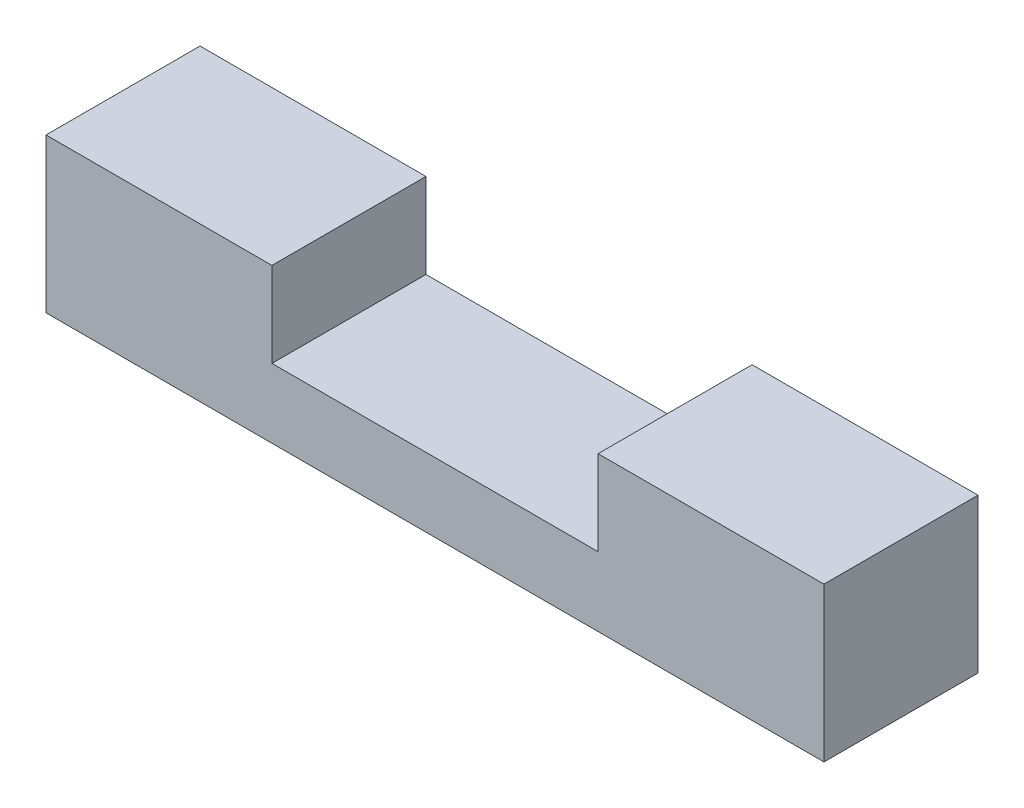
ISO-10303-21;
HEADER;
FILE_DESCRIPTION(('STEP AP214'),'2;1');
FILE_NAME('part.step','',(''),(''),'','','');
FILE_SCHEMA(('AUTOMOTIVE_DESIGN { 1 0 10303 214 1 1 1 1 }'));
ENDSEC;
DATA;
#1=APPLICATION_CONTEXT('core data for automotive mechanical design processes');
#2=APPLICATION_PROTOCOL_DEFINITION('international standard','automotive_design',2000,#1);
#3=PRODUCT_CONTEXT('',#1,'mechanical');
#4=PRODUCT('Part','Part','',(#3));
#5=PRODUCT_RELATED_PRODUCT_CATEGORY('part','',(#4));
#6=PRODUCT_DEFINITION_FORMATION('','',#4);
#7=PRODUCT_DEFINITION_CONTEXT('part definition',#1,'design');
#8=PRODUCT_DEFINITION('design','',#6,#7);
#9=PRODUCT_DEFINITION_SHAPE('','',#8);
#10=(LENGTH_UNIT() NAMED_UNIT(*) SI_UNIT(.MILLI.,.METRE.));
#11=(NAMED_UNIT(*) PLANE_ANGLE_UNIT() SI_UNIT($,.RADIAN.));
#12=(NAMED_UNIT(*) SI_UNIT($,.STERADIAN.) SOLID_ANGLE_UNIT());
#13=UNCERTAINTY_MEASURE_WITH_UNIT(LENGTH_MEASURE(1.E-05),#10,'distance_accuracy_value','');
#14=(GEOMETRIC_REPRESENTATION_CONTEXT(3) GLOBAL_UNCERTAINTY_ASSIGNED_CONTEXT((#13)) GLOBAL_UNIT_ASSIGNED_CONTEXT((#10,
#11,#12)) REPRESENTATION_CONTEXT('',''));
#15=CARTESIAN_POINT('',(0.,0.,0.));
#16=DIRECTION('',(0.,0.,1.));
#17=DIRECTION('',(1.,0.,0.));
#18=AXIS2_PLACEMENT_3D('',#15,#16,#17);
#19=CARTESIAN_POINT('',(49.5,9.8,19.6));
#20=DIRECTION('',(-1.,0.,0.));
#21=DIRECTION('',(0.,0.,1.));
#22=AXIS2_PLACEMENT_3D('',#19,#20,#21);
#23=PLANE('',#22);
#24=DIRECTION('',(0.,1.,0.));
#25=VECTOR('',#24,1.);
#26=CARTESIAN_POINT('',(49.5,9.8,0.));
#27=LINE('',#26,#25);
#28=CARTESIAN_POINT('',(49.5,-9.8,0.));
#29=VERTEX_POINT('',#28);
#30=CARTESIAN_POINT('',(49.5,9.8,0.));
#31=VERTEX_POINT('',#30);
#32=EDGE_CURVE('E226',#29,#31,#27,.T.);
#33=ORIENTED_EDGE('',*,*,#32,.T.);
#34=DIRECTION('',(0.,0.,-1.));
#35=VECTOR('',#34,1.);
#36=CARTESIAN_POINT('',(49.5,9.8,19.6));
#37=LINE('',#36,#35);
#38=CARTESIAN_POINT('',(49.5,9.8,19.6));
#39=VERTEX_POINT('',#38);
#40=EDGE_CURVE('E11',#39,#31,#37,.T.);
#41=ORIENTED_EDGE('',*,*,#40,.F.);
#42=DIRECTION('',(0.,1.,0.));
#43=VECTOR('',#42,1.);
#44=CARTESIAN_POINT('',(49.5,9.8,19.6));
#45=LINE('',#44,#43);
#46=CARTESIAN_POINT('',(49.5,-9.8,19.6));
#47=VERTEX_POINT('',#46);
#48=EDGE_CURVE('E235',#47,#39,#45,.T.);
#49=ORIENTED_EDGE('',*,*,#48,.F.);
#50=DIRECTION('',(0.,0.,-1.));
#51=VECTOR('',#50,1.);
#52=CARTESIAN_POINT('',(49.5,-9.8,19.6));
#53=LINE('',#52,#51);
#54=EDGE_CURVE('E246',#47,#29,#53,.T.);
#55=ORIENTED_EDGE('',*,*,#54,.T.);
#56=EDGE_LOOP('',(#33,#41,#49,#55));
#57=FACE_BOUND('',#56,.T.);
#58=ADVANCED_FACE('F36',(#57),#23,.F.);
#59=CARTESIAN_POINT('',(-49.5,9.8,19.6));
#60=DIRECTION('',(0.,-1.,0.));
#61=DIRECTION('',(0.,0.,-1.));
#62=AXIS2_PLACEMENT_3D('',#59,#60,#61);
#63=PLANE('',#62);
#64=DIRECTION('',(-1.,0.,0.));
#65=VECTOR('',#64,1.);
#66=CARTESIAN_POINT('',(-49.5,9.8,19.6));
#67=LINE('',#66,#65);
#68=CARTESIAN_POINT('',(-20.75,9.8,19.6));
#69=VERTEX_POINT('',#68);
#70=CARTESIAN_POINT('',(-49.5,9.8,19.6));
#71=VERTEX_POINT('',#70);
#72=EDGE_CURVE('E238',#69,#71,#67,.T.);
#73=ORIENTED_EDGE('',*,*,#72,.F.);
#74=DIRECTION('',(0.,0.,1.));
#75=VECTOR('',#74,1.);
#76=CARTESIAN_POINT('',(-20.75,9.8,0.));
#77=LINE('',#76,#75);
#78=CARTESIAN_POINT('',(-20.75,9.8,0.));
#79=VERTEX_POINT('',#78);
#80=EDGE_CURVE('E220',#79,#69,#77,.T.);
#81=ORIENTED_EDGE('',*,*,#80,.F.);
#82=DIRECTION('',(-1.,0.,0.));
#83=VECTOR('',#82,1.);
#84=CARTESIAN_POINT('',(-49.5,9.8,0.));
#85=LINE('',#84,#83);
#86=CARTESIAN_POINT('',(-49.5,9.8,0.));
#87=VERTEX_POINT('',#86);
#88=EDGE_CURVE('E249',#79,#87,#85,.T.);
#89=ORIENTED_EDGE('',*,*,#88,.T.);
#90=DIRECTION('',(0.,0.,-1.));
#91=VECTOR('',#90,1.);
#92=CARTESIAN_POINT('',(-49.5,9.8,19.6));
#93=LINE('',#92,#91);
#94=EDGE_CURVE('E44',#71,#87,#93,.T.);
#95=ORIENTED_EDGE('',*,*,#94,.F.);
#96=EDGE_LOOP('',(#73,#81,#89,#95));
#97=FACE_BOUND('',#96,.T.);
#98=ADVANCED_FACE('F286',(#97),#63,.F.);
#99=CARTESIAN_POINT('',(20.75,9.8,0.));
#100=VERTEX_POINT('',#99);
#101=EDGE_CURVE('E250',#31,#100,#85,.T.);
#102=ORIENTED_EDGE('',*,*,#101,.T.);
#103=DIRECTION('',(0.,0.,-1.));
#104=VECTOR('',#103,1.);
#105=CARTESIAN_POINT('',(20.75,9.8,0.));
#106=LINE('',#105,#104);
#107=CARTESIAN_POINT('',(20.75,9.8,19.6));
#108=VERTEX_POINT('',#107);
#109=EDGE_CURVE('E214',#108,#100,#106,.T.);
#110=ORIENTED_EDGE('',*,*,#109,.F.);
#111=EDGE_CURVE('E240',#39,#108,#67,.T.);
#112=ORIENTED_EDGE('',*,*,#111,.F.);
#113=ORIENTED_EDGE('',*,*,#40,.T.);
#114=EDGE_LOOP('',(#102,#110,#112,#113));
#115=FACE_BOUND('',#114,.T.);
#116=ADVANCED_FACE('F295',(#115),#63,.F.);
#117=CARTESIAN_POINT('',(-49.5,9.8,19.6));
#118=DIRECTION('',(1.,0.,0.));
#119=DIRECTION('',(0.,0.,-1.));
#120=AXIS2_PLACEMENT_3D('',#117,#118,#119);
#121=PLANE('',#120);
#122=DIRECTION('',(0.,-1.,0.));
#123=VECTOR('',#122,1.);
#124=CARTESIAN_POINT('',(-49.5,9.8,0.));
#125=LINE('',#124,#123);
#126=CARTESIAN_POINT('',(-49.5,-9.8,0.));
#127=VERTEX_POINT('',#126);
#128=EDGE_CURVE('E252',#87,#127,#125,.T.);
#129=ORIENTED_EDGE('',*,*,#128,.T.);
#130=DIRECTION('',(0.,0.,-1.));
#131=VECTOR('',#130,1.);
#132=CARTESIAN_POINT('',(-49.5,-9.8,19.6));
#133=LINE('',#132,#131);
#134=CARTESIAN_POINT('',(-49.5,-9.8,19.6));
#135=VERTEX_POINT('',#134);
#136=EDGE_CURVE('E257',#135,#127,#133,.T.);
#137=ORIENTED_EDGE('',*,*,#136,.F.);
#138=DIRECTION('',(0.,-1.,0.));
#139=VECTOR('',#138,1.);
#140=CARTESIAN_POINT('',(-49.5,9.8,19.6));
#141=LINE('',#140,#139);
#142=EDGE_CURVE('E242',#71,#135,#141,.T.);
#143=ORIENTED_EDGE('',*,*,#142,.F.);
#144=ORIENTED_EDGE('',*,*,#94,.T.);
#145=EDGE_LOOP('',(#129,#137,#143,#144));
#146=FACE_BOUND('',#145,.T.);
#147=ADVANCED_FACE('F264',(#146),#121,.F.);
#148=CARTESIAN_POINT('',(-49.5,-9.8,19.6));
#149=DIRECTION('',(0.,1.,0.));
#150=DIRECTION('',(0.,0.,1.));
#151=AXIS2_PLACEMENT_3D('',#148,#149,#150);
#152=PLANE('',#151);
#153=ORIENTED_EDGE('',*,*,#54,.F.);
#154=DIRECTION('',(1.,0.,0.));
#155=VECTOR('',#154,1.);
#156=CARTESIAN_POINT('',(-49.5,-9.8,19.6));
#157=LINE('',#156,#155);
#158=EDGE_CURVE('E244',#135,#47,#157,.T.);
#159=ORIENTED_EDGE('',*,*,#158,.F.);
#160=ORIENTED_EDGE('',*,*,#136,.T.);
#161=DIRECTION('',(1.,0.,0.));
#162=VECTOR('',#161,1.);
#163=CARTESIAN_POINT('',(-49.5,-9.8,0.));
#164=LINE('',#163,#162);
#165=EDGE_CURVE('E239',#127,#29,#164,.T.);
#166=ORIENTED_EDGE('',*,*,#165,.T.);
#167=EDGE_LOOP('',(#153,#159,#160,#166));
#168=FACE_BOUND('',#167,.T.);
#169=ADVANCED_FACE('F276',(#168),#152,.F.);
#170=CARTESIAN_POINT('',(0.,0.,19.6));
#171=DIRECTION('',(0.,0.,1.));
#172=DIRECTION('',(1.,0.,0.));
#173=AXIS2_PLACEMENT_3D('',#170,#171,#172);
#174=PLANE('',#173);
#175=ORIENTED_EDGE('',*,*,#111,.T.);
#176=DIRECTION('',(0.,1.,0.));
#177=VECTOR('',#176,1.);
#178=CARTESIAN_POINT('',(20.75,-0.999999999999999,19.6));
#179=LINE('',#178,#177);
#180=CARTESIAN_POINT('',(20.75,-0.999999999999999,19.6));
#181=VERTEX_POINT('',#180);
#182=EDGE_CURVE('E230',#181,#108,#179,.T.);
#183=ORIENTED_EDGE('',*,*,#182,.F.);
#184=DIRECTION('',(1.,0.,0.));
#185=VECTOR('',#184,1.);
#186=CARTESIAN_POINT('',(20.75,-0.999999999999999,19.6));
#187=LINE('',#186,#185);
#188=CARTESIAN_POINT('',(-20.75,-0.999999999999999,19.6));
#189=VERTEX_POINT('',#188);
#190=EDGE_CURVE('E213',#189,#181,#187,.T.);
#191=ORIENTED_EDGE('',*,*,#190,.F.);
#192=DIRECTION('',(0.,1.,0.));
#193=VECTOR('',#192,1.);
#194=CARTESIAN_POINT('',(-20.75,-0.999999999999999,19.6));
#195=LINE('',#194,#193);
#196=EDGE_CURVE('E219',#189,#69,#195,.T.);
#197=ORIENTED_EDGE('',*,*,#196,.T.);
#198=ORIENTED_EDGE('',*,*,#72,.T.);
#199=ORIENTED_EDGE('',*,*,#142,.T.);
#200=ORIENTED_EDGE('',*,*,#158,.T.);
#201=ORIENTED_EDGE('',*,*,#48,.T.);
#202=EDGE_LOOP('',(#175,#183,#191,#197,#198,#199,#200,#201));
#203=FACE_BOUND('',#202,.T.);
#204=ADVANCED_FACE('F282',(#203),#174,.T.);
#205=CARTESIAN_POINT('',(0.,0.,0.));
#206=DIRECTION('',(0.,0.,1.));
#207=DIRECTION('',(1.,0.,0.));
#208=AXIS2_PLACEMENT_3D('',#205,#206,#207);
#209=PLANE('',#208);
#210=ORIENTED_EDGE('',*,*,#32,.F.);
#211=ORIENTED_EDGE('',*,*,#165,.F.);
#212=ORIENTED_EDGE('',*,*,#128,.F.);
#213=ORIENTED_EDGE('',*,*,#88,.F.);
#214=DIRECTION('',(0.,1.,0.));
#215=VECTOR('',#214,1.);
#216=CARTESIAN_POINT('',(-20.75,-0.999999999999999,0.));
#217=LINE('',#216,#215);
#218=CARTESIAN_POINT('',(-20.75,-0.999999999999999,0.));
#219=VERTEX_POINT('',#218);
#220=EDGE_CURVE('E224',#219,#79,#217,.T.);
#221=ORIENTED_EDGE('',*,*,#220,.F.);
#222=DIRECTION('',(-1.,0.,0.));
#223=VECTOR('',#222,1.);
#224=CARTESIAN_POINT('',(20.75,-0.999999999999999,0.));
#225=LINE('',#224,#223);
#226=CARTESIAN_POINT('',(20.75,-0.999999999999999,0.));
#227=VERTEX_POINT('',#226);
#228=EDGE_CURVE('E217',#227,#219,#225,.T.);
#229=ORIENTED_EDGE('',*,*,#228,.F.);
#230=DIRECTION('',(0.,1.,0.));
#231=VECTOR('',#230,1.);
#232=CARTESIAN_POINT('',(20.75,-0.999999999999999,0.));
#233=LINE('',#232,#231);
#234=EDGE_CURVE('E227',#227,#100,#233,.T.);
#235=ORIENTED_EDGE('',*,*,#234,.T.);
#236=ORIENTED_EDGE('',*,*,#101,.F.);
#237=EDGE_LOOP('',(#210,#211,#212,#213,#221,#229,#235,#236));
#238=FACE_BOUND('',#237,.T.);
#239=ADVANCED_FACE('F272',(#238),#209,.F.);
#240=CARTESIAN_POINT('',(-20.75,-0.999999999999999,0.));
#241=DIRECTION('',(-1.,0.,0.));
#242=DIRECTION('',(0.,0.,1.));
#243=AXIS2_PLACEMENT_3D('',#240,#241,#242);
#244=PLANE('',#243);
#245=ORIENTED_EDGE('',*,*,#80,.T.);
#246=ORIENTED_EDGE('',*,*,#196,.F.);
#247=DIRECTION('',(0.,0.,1.));
#248=VECTOR('',#247,1.);
#249=CARTESIAN_POINT('',(-20.75,-0.999999999999999,0.));
#250=LINE('',#249,#248);
#251=EDGE_CURVE('E210',#219,#189,#250,.T.);
#252=ORIENTED_EDGE('',*,*,#251,.F.);
#253=ORIENTED_EDGE('',*,*,#220,.T.);
#254=EDGE_LOOP('',(#245,#246,#252,#253));
#255=FACE_BOUND('',#254,.T.);
#256=ADVANCED_FACE('F288',(#255),#244,.F.);
#257=CARTESIAN_POINT('',(20.75,-0.999999999999999,0.));
#258=DIRECTION('',(1.,0.,0.));
#259=DIRECTION('',(0.,0.,-1.));
#260=AXIS2_PLACEMENT_3D('',#257,#258,#259);
#261=PLANE('',#260);
#262=ORIENTED_EDGE('',*,*,#109,.T.);
#263=ORIENTED_EDGE('',*,*,#234,.F.);
#264=DIRECTION('',(0.,0.,-1.));
#265=VECTOR('',#264,1.);
#266=CARTESIAN_POINT('',(20.75,-0.999999999999999,0.));
#267=LINE('',#266,#265);
#268=EDGE_CURVE('E59',#181,#227,#267,.T.);
#269=ORIENTED_EDGE('',*,*,#268,.F.);
#270=ORIENTED_EDGE('',*,*,#182,.T.);
#271=EDGE_LOOP('',(#262,#263,#269,#270));
#272=FACE_BOUND('',#271,.T.);
#273=ADVANCED_FACE('F293',(#272),#261,.F.);
#274=CARTESIAN_POINT('',(0.,-0.999999999999999,0.));
#275=DIRECTION('',(0.,-1.,0.));
#276=DIRECTION('',(0.,0.,-1.));
#277=AXIS2_PLACEMENT_3D('',#274,#275,#276);
#278=PLANE('',#277);
#279=ORIENTED_EDGE('',*,*,#251,.T.);
#280=ORIENTED_EDGE('',*,*,#190,.T.);
#281=ORIENTED_EDGE('',*,*,#268,.T.);
#282=ORIENTED_EDGE('',*,*,#228,.T.);
#283=EDGE_LOOP('',(#279,#280,#281,#282));
#284=FACE_BOUND('',#283,.T.);
#285=ADVANCED_FACE('F290',(#284),#278,.F.);
#286=CLOSED_SHELL('',(#58,#98,#116,#147,#169,#204,#239,#256,#273,#285));
#287=CARTESIAN_POINT('',(-47.5,9.8,19.6));
#288=DIRECTION('',(1.,0.,0.));
#289=DIRECTION('',(0.,0.,-1.));
#290=AXIS2_PLACEMENT_3D('',#287,#288,#289);
#291=PLANE('',#290);
#292=DIRECTION('',(0.,-1.,0.));
#293=VECTOR('',#292,1.);
#294=CARTESIAN_POINT('',(-47.5,9.8,2.));
#295=LINE('',#294,#293);
#296=CARTESIAN_POINT('',(-47.5,7.8,2.));
#297=VERTEX_POINT('',#296);
#298=CARTESIAN_POINT('',(-47.5,-7.8,2.));
#299=VERTEX_POINT('',#298);
#300=EDGE_CURVE('E180',#297,#299,#295,.T.);
#301=ORIENTED_EDGE('',*,*,#300,.F.);
#302=DIRECTION('',(0.,0.,-1.));
#303=VECTOR('',#302,1.);
#304=CARTESIAN_POINT('',(-47.5,7.8,19.6));
#305=LINE('',#304,#303);
#306=CARTESIAN_POINT('',(-47.5,7.8,17.6));
#307=VERTEX_POINT('',#306);
#308=EDGE_CURVE('E173',#307,#297,#305,.T.);
#309=ORIENTED_EDGE('',*,*,#308,.F.);
#310=DIRECTION('',(0.,-1.,0.));
#311=VECTOR('',#310,1.);
#312=CARTESIAN_POINT('',(-47.5,9.8,17.6));
#313=LINE('',#312,#311);
#314=CARTESIAN_POINT('',(-47.5,-7.8,17.6));
#315=VERTEX_POINT('',#314);
#316=EDGE_CURVE('E171',#307,#315,#313,.T.);
#317=ORIENTED_EDGE('',*,*,#316,.T.);
#318=DIRECTION('',(0.,0.,-1.));
#319=VECTOR('',#318,1.);
#320=CARTESIAN_POINT('',(-47.5,-7.8,19.6));
#321=LINE('',#320,#319);
#322=EDGE_CURVE('E170',#315,#299,#321,.T.);
#323=ORIENTED_EDGE('',*,*,#322,.T.);
#324=EDGE_LOOP('',(#301,#309,#317,#323));
#325=FACE_BOUND('',#324,.T.);
#326=ADVANCED_FACE('F379',(#325),#291,.T.);
#327=CARTESIAN_POINT('',(-49.5,7.8,19.6));
#328=DIRECTION('',(0.,-1.,0.));
#329=DIRECTION('',(0.,0.,-1.));
#330=AXIS2_PLACEMENT_3D('',#327,#328,#329);
#331=PLANE('',#330);
#332=DIRECTION('',(-1.,0.,0.));
#333=VECTOR('',#332,1.);
#334=CARTESIAN_POINT('',(-49.5,7.8,17.6));
#335=LINE('',#334,#333);
#336=CARTESIAN_POINT('',(-22.75,7.8,17.6));
#337=VERTEX_POINT('',#336);
#338=EDGE_CURVE('E179',#337,#307,#335,.T.);
#339=ORIENTED_EDGE('',*,*,#338,.T.);
#340=ORIENTED_EDGE('',*,*,#308,.T.);
#341=DIRECTION('',(-1.,0.,0.));
#342=VECTOR('',#341,1.);
#343=CARTESIAN_POINT('',(-49.5,7.8,2.));
#344=LINE('',#343,#342);
#345=CARTESIAN_POINT('',(-22.75,7.8,2.));
#346=VERTEX_POINT('',#345);
#347=EDGE_CURVE('E196',#346,#297,#344,.T.);
#348=ORIENTED_EDGE('',*,*,#347,.F.);
#349=DIRECTION('',(0.,0.,1.));
#350=VECTOR('',#349,1.);
#351=CARTESIAN_POINT('',(-22.75,7.8,0.));
#352=LINE('',#351,#350);
#353=EDGE_CURVE('E200',#346,#337,#352,.T.);
#354=ORIENTED_EDGE('',*,*,#353,.T.);
#355=EDGE_LOOP('',(#339,#340,#348,#354));
#356=FACE_BOUND('',#355,.T.);
#357=ADVANCED_FACE('F373',(#356),#331,.T.);
#358=CARTESIAN_POINT('',(-22.75,-0.999999999999999,0.));
#359=DIRECTION('',(-1.,0.,0.));
#360=DIRECTION('',(0.,0.,1.));
#361=AXIS2_PLACEMENT_3D('',#358,#359,#360);
#362=PLANE('',#361);
#363=ORIENTED_EDGE('',*,*,#353,.F.);
#364=DIRECTION('',(0.,1.,0.));
#365=VECTOR('',#364,1.);
#366=CARTESIAN_POINT('',(-22.75,-0.999999999999999,2.));
#367=LINE('',#366,#365);
#368=CARTESIAN_POINT('',(-22.75,-3.,2.));
#369=VERTEX_POINT('',#368);
#370=EDGE_CURVE('E201',#369,#346,#367,.T.);
#371=ORIENTED_EDGE('',*,*,#370,.F.);
#372=DIRECTION('',(0.,0.,1.));
#373=VECTOR('',#372,1.);
#374=CARTESIAN_POINT('',(-22.75,-3.,0.));
#375=LINE('',#374,#373);
#376=CARTESIAN_POINT('',(-22.75,-3.,17.6));
#377=VERTEX_POINT('',#376);
#378=EDGE_CURVE('E190',#369,#377,#375,.T.);
#379=ORIENTED_EDGE('',*,*,#378,.T.);
#380=DIRECTION('',(0.,1.,0.));
#381=VECTOR('',#380,1.);
#382=CARTESIAN_POINT('',(-22.75,-0.999999999999999,17.6));
#383=LINE('',#382,#381);
#384=EDGE_CURVE('E185',#377,#337,#383,.T.);
#385=ORIENTED_EDGE('',*,*,#384,.T.);
#386=EDGE_LOOP('',(#363,#371,#379,#385));
#387=FACE_BOUND('',#386,.T.);
#388=ADVANCED_FACE('F378',(#387),#362,.T.);
#389=CARTESIAN_POINT('',(0.,-3.,0.));
#390=DIRECTION('',(0.,-1.,0.));
#391=DIRECTION('',(0.,0.,-1.));
#392=AXIS2_PLACEMENT_3D('',#389,#390,#391);
#393=PLANE('',#392);
#394=ORIENTED_EDGE('',*,*,#378,.F.);
#395=DIRECTION('',(-1.,0.,0.));
#396=VECTOR('',#395,1.);
#397=CARTESIAN_POINT('',(0.,-3.,2.));
#398=LINE('',#397,#396);
#399=CARTESIAN_POINT('',(22.75,-3.,2.));
#400=VERTEX_POINT('',#399);
#401=EDGE_CURVE('E193',#400,#369,#398,.T.);
#402=ORIENTED_EDGE('',*,*,#401,.F.);
#403=DIRECTION('',(0.,0.,-1.));
#404=VECTOR('',#403,1.);
#405=CARTESIAN_POINT('',(22.75,-3.,0.));
#406=LINE('',#405,#404);
#407=CARTESIAN_POINT('',(22.75,-3.,17.6));
#408=VERTEX_POINT('',#407);
#409=EDGE_CURVE('E189',#408,#400,#406,.T.);
#410=ORIENTED_EDGE('',*,*,#409,.F.);
#411=DIRECTION('',(1.,0.,0.));
#412=VECTOR('',#411,1.);
#413=CARTESIAN_POINT('',(0.,-3.,17.6));
#414=LINE('',#413,#412);
#415=EDGE_CURVE('E186',#377,#408,#414,.T.);
#416=ORIENTED_EDGE('',*,*,#415,.F.);
#417=EDGE_LOOP('',(#394,#402,#410,#416));
#418=FACE_BOUND('',#417,.T.);
#419=ADVANCED_FACE('F399',(#418),#393,.T.);
#420=CARTESIAN_POINT('',(22.75,-0.999999999999999,0.));
#421=DIRECTION('',(1.,0.,0.));
#422=DIRECTION('',(0.,0.,-1.));
#423=AXIS2_PLACEMENT_3D('',#420,#421,#422);
#424=PLANE('',#423);
#425=DIRECTION('',(0.,0.,-1.));
#426=VECTOR('',#425,1.);
#427=CARTESIAN_POINT('',(22.75,7.8,0.));
#428=LINE('',#427,#426);
#429=CARTESIAN_POINT('',(22.75,7.8,17.6));
#430=VERTEX_POINT('',#429);
#431=CARTESIAN_POINT('',(22.75,7.8,2.));
#432=VERTEX_POINT('',#431);
#433=EDGE_CURVE('E197',#430,#432,#428,.T.);
#434=ORIENTED_EDGE('',*,*,#433,.F.);
#435=DIRECTION('',(0.,1.,0.));
#436=VECTOR('',#435,1.);
#437=CARTESIAN_POINT('',(22.75,0.,17.6));
#438=LINE('',#437,#436);
#439=EDGE_CURVE('E182',#408,#430,#438,.T.);
#440=ORIENTED_EDGE('',*,*,#439,.F.);
#441=ORIENTED_EDGE('',*,*,#409,.T.);
#442=DIRECTION('',(0.,1.,0.));
#443=VECTOR('',#442,1.);
#444=CARTESIAN_POINT('',(22.75,0.,2.));
#445=LINE('',#444,#443);
#446=EDGE_CURVE('E184',#400,#432,#445,.T.);
#447=ORIENTED_EDGE('',*,*,#446,.T.);
#448=EDGE_LOOP('',(#434,#440,#441,#447));
#449=FACE_BOUND('',#448,.T.);
#450=ADVANCED_FACE('F407',(#449),#424,.T.);
#451=CARTESIAN_POINT('',(0.,0.,2.));
#452=DIRECTION('',(0.,0.,1.));
#453=DIRECTION('',(1.,0.,0.));
#454=AXIS2_PLACEMENT_3D('',#451,#452,#453);
#455=PLANE('',#454);
#456=DIRECTION('',(1.,0.,0.));
#457=VECTOR('',#456,1.);
#458=CARTESIAN_POINT('',(-49.5,-7.8,2.));
#459=LINE('',#458,#457);
#460=CARTESIAN_POINT('',(47.5,-7.8,2.));
#461=VERTEX_POINT('',#460);
#462=EDGE_CURVE('E177',#299,#461,#459,.T.);
#463=ORIENTED_EDGE('',*,*,#462,.T.);
#464=DIRECTION('',(0.,1.,0.));
#465=VECTOR('',#464,1.);
#466=CARTESIAN_POINT('',(47.5,7.8,2.));
#467=LINE('',#466,#465);
#468=CARTESIAN_POINT('',(47.5,7.8,2.));
#469=VERTEX_POINT('',#468);
#470=EDGE_CURVE('E152',#461,#469,#467,.T.);
#471=ORIENTED_EDGE('',*,*,#470,.T.);
#472=DIRECTION('',(-1.,0.,0.));
#473=VECTOR('',#472,1.);
#474=CARTESIAN_POINT('',(-49.5,7.8,2.));
#475=LINE('',#474,#473);
#476=EDGE_CURVE('E194',#469,#432,#475,.T.);
#477=ORIENTED_EDGE('',*,*,#476,.T.);
#478=ORIENTED_EDGE('',*,*,#446,.F.);
#479=ORIENTED_EDGE('',*,*,#401,.T.);
#480=ORIENTED_EDGE('',*,*,#370,.T.);
#481=ORIENTED_EDGE('',*,*,#347,.T.);
#482=ORIENTED_EDGE('',*,*,#300,.T.);
#483=EDGE_LOOP('',(#463,#471,#477,#478,#479,#480,#481,#482));
#484=FACE_BOUND('',#483,.T.);
#485=ADVANCED_FACE('F410',(#484),#455,.T.);
#486=CARTESIAN_POINT('',(0.,0.,17.6));
#487=DIRECTION('',(0.,0.,1.));
#488=DIRECTION('',(1.,0.,0.));
#489=AXIS2_PLACEMENT_3D('',#486,#487,#488);
#490=PLANE('',#489);
#491=DIRECTION('',(0.,-1.,0.));
#492=VECTOR('',#491,1.);
#493=CARTESIAN_POINT('',(47.5,7.8,17.6));
#494=LINE('',#493,#492);
#495=CARTESIAN_POINT('',(47.5,7.8,17.6));
#496=VERTEX_POINT('',#495);
#497=CARTESIAN_POINT('',(47.5,-7.8,17.6));
#498=VERTEX_POINT('',#497);
#499=EDGE_CURVE('E151',#496,#498,#494,.T.);
#500=ORIENTED_EDGE('',*,*,#499,.T.);
#501=DIRECTION('',(1.,0.,0.));
#502=VECTOR('',#501,1.);
#503=CARTESIAN_POINT('',(-49.5,-7.8,17.6));
#504=LINE('',#503,#502);
#505=EDGE_CURVE('E163',#315,#498,#504,.T.);
#506=ORIENTED_EDGE('',*,*,#505,.F.);
#507=ORIENTED_EDGE('',*,*,#316,.F.);
#508=ORIENTED_EDGE('',*,*,#338,.F.);
#509=ORIENTED_EDGE('',*,*,#384,.F.);
#510=ORIENTED_EDGE('',*,*,#415,.T.);
#511=ORIENTED_EDGE('',*,*,#439,.T.);
#512=DIRECTION('',(-1.,0.,0.));
#513=VECTOR('',#512,1.);
#514=CARTESIAN_POINT('',(-49.5,7.8,17.6));
#515=LINE('',#514,#513);
#516=EDGE_CURVE('E165',#496,#430,#515,.T.);
#517=ORIENTED_EDGE('',*,*,#516,.F.);
#518=EDGE_LOOP('',(#500,#506,#507,#508,#509,#510,#511,#517));
#519=FACE_BOUND('',#518,.T.);
#520=ADVANCED_FACE('F161',(#519),#490,.F.);
#521=CARTESIAN_POINT('',(-49.5,-7.8,19.6));
#522=DIRECTION('',(0.,1.,0.));
#523=DIRECTION('',(0.,0.,1.));
#524=AXIS2_PLACEMENT_3D('',#521,#522,#523);
#525=PLANE('',#524);
#526=ORIENTED_EDGE('',*,*,#505,.T.);
#527=DIRECTION('',(0.,0.,-1.));
#528=VECTOR('',#527,1.);
#529=CARTESIAN_POINT('',(47.5,-7.8,17.6));
#530=LINE('',#529,#528);
#531=EDGE_CURVE('E148',#498,#461,#530,.T.);
#532=ORIENTED_EDGE('',*,*,#531,.T.);
#533=ORIENTED_EDGE('',*,*,#462,.F.);
#534=ORIENTED_EDGE('',*,*,#322,.F.);
#535=EDGE_LOOP('',(#526,#532,#533,#534));
#536=FACE_BOUND('',#535,.T.);
#537=ADVANCED_FACE('F168',(#536),#525,.T.);
#538=ORIENTED_EDGE('',*,*,#476,.F.);
#539=DIRECTION('',(0.,0.,1.));
#540=VECTOR('',#539,1.);
#541=CARTESIAN_POINT('',(47.5,7.8,17.6));
#542=LINE('',#541,#540);
#543=EDGE_CURVE('E51',#469,#496,#542,.T.);
#544=ORIENTED_EDGE('',*,*,#543,.T.);
#545=ORIENTED_EDGE('',*,*,#516,.T.);
#546=ORIENTED_EDGE('',*,*,#433,.T.);
#547=EDGE_LOOP('',(#538,#544,#545,#546));
#548=FACE_BOUND('',#547,.T.);
#549=ADVANCED_FACE('F382',(#548),#331,.T.);
#550=CARTESIAN_POINT('',(47.5,0.,0.));
#551=DIRECTION('',(1.,0.,0.));
#552=DIRECTION('',(0.,0.,-1.));
#553=AXIS2_PLACEMENT_3D('',#550,#551,#552);
#554=PLANE('',#553);
#555=ORIENTED_EDGE('',*,*,#499,.F.);
#556=ORIENTED_EDGE('',*,*,#543,.F.);
#557=ORIENTED_EDGE('',*,*,#470,.F.);
#558=ORIENTED_EDGE('',*,*,#531,.F.);
#559=EDGE_LOOP('',(#555,#556,#557,#558));
#560=FACE_BOUND('',#559,.T.);
#561=ADVANCED_FACE('F150',(#560),#554,.F.);
#562=CLOSED_SHELL('',(#326,#357,#388,#419,#450,#485,#520,#537,#549,#561));
#563=ORIENTED_CLOSED_SHELL('',*,#562,.T.);
#564=BREP_WITH_VOIDS('B2',#286,(#563));
#565=ADVANCED_BREP_SHAPE_REPRESENTATION('',(#18,#564),#14);
#566=SHAPE_DEFINITION_REPRESENTATION(#9,#565);
ENDSEC;
END-ISO-10303-21;
